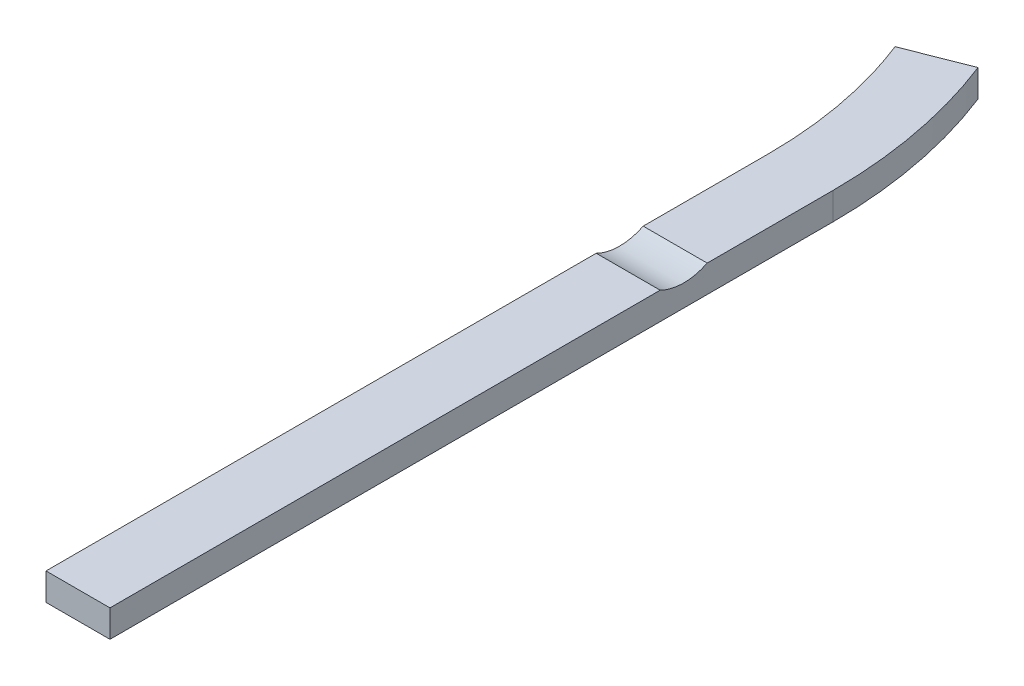
ISO-10303-21;
HEADER;
FILE_DESCRIPTION(('STEP AP214'),'2;1');
FILE_NAME('part.step','',(''),(''),'','','');
FILE_SCHEMA(('AUTOMOTIVE_DESIGN { 1 0 10303 214 1 1 1 1 }'));
ENDSEC;
DATA;
#1=APPLICATION_CONTEXT('core data for automotive mechanical design processes');
#2=APPLICATION_PROTOCOL_DEFINITION('international standard','automotive_design',2000,#1);
#3=PRODUCT_CONTEXT('',#1,'mechanical');
#4=PRODUCT('Part','Part','',(#3));
#5=PRODUCT_RELATED_PRODUCT_CATEGORY('part','',(#4));
#6=PRODUCT_DEFINITION_FORMATION('','',#4);
#7=PRODUCT_DEFINITION_CONTEXT('part definition',#1,'design');
#8=PRODUCT_DEFINITION('design','',#6,#7);
#9=PRODUCT_DEFINITION_SHAPE('','',#8);
#10=(LENGTH_UNIT() NAMED_UNIT(*) SI_UNIT(.MILLI.,.METRE.));
#11=(NAMED_UNIT(*) PLANE_ANGLE_UNIT() SI_UNIT($,.RADIAN.));
#12=(NAMED_UNIT(*) SI_UNIT($,.STERADIAN.) SOLID_ANGLE_UNIT());
#13=UNCERTAINTY_MEASURE_WITH_UNIT(LENGTH_MEASURE(1.E-05),#10,'distance_accuracy_value','');
#14=(GEOMETRIC_REPRESENTATION_CONTEXT(3) GLOBAL_UNCERTAINTY_ASSIGNED_CONTEXT((#13)) GLOBAL_UNIT_ASSIGNED_CONTEXT((#10,
#11,#12)) REPRESENTATION_CONTEXT('',''));
#15=CARTESIAN_POINT('',(0.,0.,0.));
#16=DIRECTION('',(0.,0.,1.));
#17=DIRECTION('',(1.,0.,0.));
#18=AXIS2_PLACEMENT_3D('',#15,#16,#17);
#19=CARTESIAN_POINT('',(207.825,20.84183441299,-37.61967793308));
#20=DIRECTION('',(0.,1.,0.));
#21=DIRECTION('',(0.,0.,1.));
#22=AXIS2_PLACEMENT_3D('',#19,#20,#21);
#23=PLANE('',#22);
#24=CARTESIAN_POINT('',(209.800003315921,20.8418344129906,-58.1141130504038));
#25=CARTESIAN_POINT('',(209.141670177305,20.8418344129906,-58.1141788166733));
#26=CARTESIAN_POINT('',(208.483337038689,20.8418344129906,-58.1142445885298));
#27=CARTESIAN_POINT('',(207.166670761458,20.8418344129906,-58.1143761434172));
#28=CARTESIAN_POINT('',(206.508337622843,20.8418344129906,-58.114441926448));
#29=CARTESIAN_POINT('',(205.850004484228,20.8418344129906,-58.1145077150658));
#30=B_SPLINE_CURVE_WITH_KNOTS('',3,(#24,#25,#26,#27,#28,#29),.UNSPECIFIED.,.F.,.F.,(4,2,4),(0.,
1.97499942570457,3.94999885140915),.UNSPECIFIED.);
#31=CARTESIAN_POINT('',(209.800001657661,20.8418344129906,-58.1141130505695));
#32=VERTEX_POINT('',#31);
#33=CARTESIAN_POINT('',(205.850002242115,20.8418344129906,-58.1145077152899));
#34=VERTEX_POINT('',#33);
#35=EDGE_CURVE('E21',#32,#34,#30,.T.);
#36=ORIENTED_EDGE('',*,*,#35,.T.);
#37=DIRECTION('',(0.,0.,-1.));
#38=VECTOR('',#37,1.);
#39=CARTESIAN_POINT('',(205.85,20.8418344129909,-68.7999999999978));
#40=LINE('',#39,#38);
#41=CARTESIAN_POINT('',(205.85,20.8418344129898,-24.14009611321));
#42=VERTEX_POINT('',#41);
#43=EDGE_CURVE('E119',#42,#34,#40,.T.);
#44=ORIENTED_EDGE('',*,*,#43,.F.);
#45=DIRECTION('',(-1.,0.,0.));
#46=VECTOR('',#45,1.);
#47=CARTESIAN_POINT('',(207.825,20.84183441299,-24.14009611321));
#48=LINE('',#47,#46);
#49=CARTESIAN_POINT('',(209.7999999997,20.8418344129899,-24.14009611321));
#50=VERTEX_POINT('',#49);
#51=EDGE_CURVE('E89',#42,#50,#48,.F.);
#52=ORIENTED_EDGE('',*,*,#51,.T.);
#53=DIRECTION('',(0.,0.,1.));
#54=VECTOR('',#53,1.);
#55=CARTESIAN_POINT('',(209.7999999994,20.84183441299,-37.61967793308));
#56=LINE('',#55,#54);
#57=EDGE_CURVE('E85',#50,#32,#56,.F.);
#58=ORIENTED_EDGE('',*,*,#57,.T.);
#59=EDGE_LOOP('',(#36,#44,#52,#58));
#60=FACE_BOUND('',#59,.T.);
#61=ADVANCED_FACE('F17',(#60),#23,.T.);
#62=CARTESIAN_POINT('',(207.825,23.75009843451,-59.56499999621));
#63=DIRECTION('',(0.999999998757974,-4.98402579270987E-05,-1.91760193983295E-09));
#64=DIRECTION('',(4.98402579270987E-05,0.999999998757974,0.));
#65=AXIS2_PLACEMENT_3D('',#62,#63,#64);
#66=CYLINDRICAL_SURFACE('',#65,3.25);
#67=CARTESIAN_POINT('',(205.85,23.7501968690195,-59.5649999924227));
#68=DIRECTION('',(-1.,0.,0.));
#69=DIRECTION('',(0.,-0.999999999259839,-3.84749601661069E-05));
#70=AXIS2_PLACEMENT_3D('',#67,#68,#69);
#71=ELLIPSE('',#70,3.25000000403658,3.25);
#72=CARTESIAN_POINT('',(205.850000959887,20.8419964703173,-61.0158171629429));
#73=VERTEX_POINT('',#72);
#74=EDGE_CURVE('E101',#34,#73,#71,.F.);
#75=ORIENTED_EDGE('',*,*,#74,.F.);
#76=ORIENTED_EDGE('',*,*,#35,.F.);
#77=CARTESIAN_POINT('',(209.8,23.7500000000005,-59.5649999999973));
#78=DIRECTION('',(-1.,0.,0.));
#79=DIRECTION('',(0.,-0.999999999259839,-3.84749601661069E-05));
#80=AXIS2_PLACEMENT_3D('',#77,#78,#79);
#81=ELLIPSE('',#80,3.25000000403658,3.25);
#82=CARTESIAN_POINT('',(209.800001853987,20.8419964815801,-61.0162117551865));
#83=VERTEX_POINT('',#82);
#84=EDGE_CURVE('E94',#32,#83,#81,.F.);
#85=ORIENTED_EDGE('',*,*,#84,.T.);
#86=CARTESIAN_POINT('',(205.85000191976,20.8419964703173,-61.0158171630388));
#87=CARTESIAN_POINT('',(206.508335551128,20.8419964721947,-61.0158829395963));
#88=CARTESIAN_POINT('',(207.166669182497,20.841996474072,-61.0159487105694));
#89=CARTESIAN_POINT('',(208.483336445235,20.8419964778263,-61.016080241347));
#90=CARTESIAN_POINT('',(209.141670076605,20.8419964797033,-61.0161460011515));
#91=CARTESIAN_POINT('',(209.800003707975,20.8419964815801,-61.0162117553717));
#92=B_SPLINE_CURVE_WITH_KNOTS('',3,(#86,#87,#88,#89,#90,#91),.UNSPECIFIED.,.F.,.F.,(4,2,4),(0.,
1.97500090396184,3.95000180792366),.UNSPECIFIED.);
#93=EDGE_CURVE('E103',#73,#83,#92,.T.);
#94=ORIENTED_EDGE('',*,*,#93,.F.);
#95=EDGE_LOOP('',(#75,#76,#85,#94));
#96=FACE_BOUND('',#95,.T.);
#97=ADVANCED_FACE('F98',(#96),#66,.F.);
#98=CARTESIAN_POINT('',(207.82499996,20.84209817804,-64.51849192047));
#99=DIRECTION('',(4.9360236253941E-11,0.999999999578421,2.90371865022706E-05));
#100=DIRECTION('',(0.,-2.90371865022706E-05,0.999999999578421));
#101=AXIS2_PLACEMENT_3D('',#98,#99,#100);
#102=PLANE('',#101);
#103=CARTESIAN_POINT('',(179.4760308089,20.8422214489998,-68.76372278604));
#104=DIRECTION('',(4.9360236253941E-11,0.999999999578421,2.90371865022706E-05));
#105=DIRECTION('',(1.69989734471006E-06,-2.90371865023126E-05,0.999999999576976));
#106=AXIS2_PLACEMENT_3D('',#103,#104,#105);
#107=ELLIPSE('',#106,26.3739905895787,26.37399057846);
#108=CARTESIAN_POINT('',(204.030346044496,20.8425009795123,-78.3904035402455));
#109=VERTEX_POINT('',#108);
#110=CARTESIAN_POINT('',(205.849999999037,20.8422224230148,-68.797311331455));
#111=VERTEX_POINT('',#110);
#112=EDGE_CURVE('E117',#109,#111,#107,.F.);
#113=ORIENTED_EDGE('',*,*,#112,.T.);
#114=DIRECTION('',(0.,2.90371865022706E-05,-0.999999999578421));
#115=VECTOR('',#114,1.);
#116=CARTESIAN_POINT('',(205.85,20.8422224379823,-68.7978267924279));
#117=LINE('',#116,#115);
#118=EDGE_CURVE('E122',#73,#111,#117,.T.);
#119=ORIENTED_EDGE('',*,*,#118,.F.);
#120=ORIENTED_EDGE('',*,*,#93,.T.);
#121=DIRECTION('',(0.,2.90371865022706E-05,-0.999999999578421));
#122=VECTOR('',#121,1.);
#123=CARTESIAN_POINT('',(209.8,20.8422224377873,-68.7978267924279));
#124=LINE('',#123,#122);
#125=CARTESIAN_POINT('',(209.8,20.84222250115,-68.8000089149787));
#126=VERTEX_POINT('',#125);
#127=EDGE_CURVE('E106',#83,#126,#124,.T.);
#128=ORIENTED_EDGE('',*,*,#127,.T.);
#129=CARTESIAN_POINT('',(179.4760308089,20.8422214489998,-68.76372278604));
#130=DIRECTION('',(4.9360236253941E-11,0.999999999578421,2.90371865022706E-05));
#131=DIRECTION('',(1.69989734471006E-06,-2.90371865023126E-05,0.999999999576976));
#132=AXIS2_PLACEMENT_3D('',#129,#130,#131);
#133=ELLIPSE('',#132,30.323990591244,30.32399057846);
#134=CARTESIAN_POINT('',(207.707815516139,20.842542844452,-79.832179627292));
#135=VERTEX_POINT('',#134);
#136=EDGE_CURVE('E95',#135,#126,#133,.F.);
#137=ORIENTED_EDGE('',*,*,#136,.F.);
#138=DIRECTION('',(-0.93100492970265,-1.05987188769113E-05,0.365006603717017));
#139=VECTOR('',#138,1.);
#140=CARTESIAN_POINT('',(207.707815511446,20.842542844452,-79.8321796285804));
#141=LINE('',#140,#139);
#142=EDGE_CURVE('E113',#135,#109,#141,.T.);
#143=ORIENTED_EDGE('',*,*,#142,.T.);
#144=EDGE_LOOP('',(#113,#119,#120,#128,#137,#143));
#145=FACE_BOUND('',#144,.T.);
#146=ADVANCED_FACE('F131',(#145),#102,.T.);
#147=CARTESIAN_POINT('',(207.825,19.99988393086,-24.14009611321));
#148=DIRECTION('',(0.,0.,-1.));
#149=DIRECTION('',(-1.,0.,0.));
#150=AXIS2_PLACEMENT_3D('',#147,#148,#149);
#151=PLANE('',#150);
#152=DIRECTION('',(0.,1.,0.));
#153=VECTOR('',#152,1.);
#154=CARTESIAN_POINT('',(205.85,-54.,-24.14009611321));
#155=LINE('',#154,#153);
#156=CARTESIAN_POINT('',(205.850000139397,19.1578818994322,-24.14009611321));
#157=VERTEX_POINT('',#156);
#158=EDGE_CURVE('E121',#157,#42,#155,.T.);
#159=ORIENTED_EDGE('',*,*,#158,.F.);
#160=DIRECTION('',(0.999999998273092,5.87691826888495E-05,0.));
#161=VECTOR('',#160,1.);
#162=CARTESIAN_POINT('',(207.825,19.15799796856,-24.14009611321));
#163=LINE('',#162,#161);
#164=CARTESIAN_POINT('',(209.799999925739,19.1581140376916,-24.14009611321));
#165=VERTEX_POINT('',#164);
#166=EDGE_CURVE('E174',#165,#157,#163,.F.);
#167=ORIENTED_EDGE('',*,*,#166,.F.);
#168=DIRECTION('',(0.,1.,0.));
#169=VECTOR('',#168,1.);
#170=CARTESIAN_POINT('',(209.8,-54.,-24.14009611321));
#171=LINE('',#170,#169);
#172=EDGE_CURVE('E176',#165,#50,#171,.T.);
#173=ORIENTED_EDGE('',*,*,#172,.T.);
#174=ORIENTED_EDGE('',*,*,#51,.F.);
#175=EDGE_LOOP('',(#159,#167,#173,#174));
#176=FACE_BOUND('',#175,.T.);
#177=ADVANCED_FACE('F135',(#176),#151,.F.);
#178=CARTESIAN_POINT('',(205.85,-54.,-68.8));
#179=DIRECTION('',(-1.,0.,0.));
#180=DIRECTION('',(0.,0.,1.));
#181=AXIS2_PLACEMENT_3D('',#178,#179,#180);
#182=PLANE('',#181);
#183=ORIENTED_EDGE('',*,*,#158,.T.);
#184=ORIENTED_EDGE('',*,*,#43,.T.);
#185=ORIENTED_EDGE('',*,*,#74,.T.);
#186=ORIENTED_EDGE('',*,*,#118,.T.);
#187=CARTESIAN_POINT('',(205.8499999981,20.84289771383,-68.79731206776));
#188=CARTESIAN_POINT('',(205.850000087187,20.7726851474321,-68.7972421168764));
#189=CARTESIAN_POINT('',(205.850000175997,20.7024725810342,-68.7971721659924));
#190=CARTESIAN_POINT('',(205.850000353059,20.5620474482383,-68.7970322642237));
#191=CARTESIAN_POINT('',(205.850000441312,20.4918348818404,-68.796962313339));
#192=CARTESIAN_POINT('',(205.850000617262,20.3514097490446,-68.796822411569));
#193=CARTESIAN_POINT('',(205.850000704958,20.2811971826467,-68.7967524606836));
#194=CARTESIAN_POINT('',(205.850000879794,20.1407720498508,-68.7966125589121));
#195=CARTESIAN_POINT('',(205.850000966934,20.0705594834529,-68.796542608026));
#196=CARTESIAN_POINT('',(205.850001140657,19.9301343506571,-68.7964027062532));
#197=CARTESIAN_POINT('',(205.85000122724,19.8599217842592,-68.7963327553664));
#198=CARTESIAN_POINT('',(205.85000139985,19.7194966514633,-68.7961928535922));
#199=CARTESIAN_POINT('',(205.850001485877,19.6492840850654,-68.7961229027047));
#200=CARTESIAN_POINT('',(205.850001657373,19.5088589522696,-68.7959830009291));
#201=CARTESIAN_POINT('',(205.850001742843,19.4386463858717,-68.795913050041));
#202=CARTESIAN_POINT('',(205.850001913227,19.2982212530758,-68.795773148264));
#203=CARTESIAN_POINT('',(205.85000199814,19.2280086866779,-68.7957031973752));
#204=CARTESIAN_POINT('',(205.850002082776,19.15779612028,-68.795633246486));
#205=B_SPLINE_CURVE_WITH_KNOTS('',3,(#187,#188,#189,#190,#191,#192,#193,#194,#195,#196,#197,
#198,#199,#200,#201,#202,#203,#204),.UNSPECIFIED.,.F.,.F.,(4,2,2,2,2,2,2,2,4),(0.,
0.210637803729166,0.421275607458318,0.63191341118747,0.842551214916622,1.05318901864579,
1.26382682237494,1.47446462610411,1.68510242983326),.UNSPECIFIED.);
#206=CARTESIAN_POINT('',(205.850002082723,19.1578818994513,-68.7956332895382));
#207=VERTEX_POINT('',#206);
#208=EDGE_CURVE('E116',#111,#207,#205,.T.);
#209=ORIENTED_EDGE('',*,*,#208,.T.);
#210=DIRECTION('',(0.,0.,1.));
#211=VECTOR('',#210,1.);
#212=CARTESIAN_POINT('',(205.850000278795,19.1578818994404,-46.46937898824));
#213=LINE('',#212,#211);
#214=EDGE_CURVE('E172',#157,#207,#213,.F.);
#215=ORIENTED_EDGE('',*,*,#214,.F.);
#216=EDGE_LOOP('',(#183,#184,#185,#186,#209,#215));
#217=FACE_BOUND('',#216,.T.);
#218=ADVANCED_FACE('F139',(#217),#182,.T.);
#219=CARTESIAN_POINT('',(179.4760308089,-54.,-68.76372278604));
#220=DIRECTION('',(0.,-1.,0.));
#221=DIRECTION('',(0.,0.,-1.));
#222=AXIS2_PLACEMENT_3D('',#219,#220,#221);
#223=CYLINDRICAL_SURFACE('',#222,26.37399057846);
#224=CARTESIAN_POINT('',(179.4760308089,19.1563319228077,-68.76372278604));
#225=DIRECTION('',(5.87691826888495E-05,-0.999999998273092,0.));
#226=DIRECTION('',(-0.999999998273092,-5.87691826888495E-05,0.));
#227=AXIS2_PLACEMENT_3D('',#224,#225,#226);
#228=ELLIPSE('',#227,26.3739906240055,26.37399057846);
#229=CARTESIAN_POINT('',(204.030346045627,19.1577749598481,-78.3904035373592));
#230=VERTEX_POINT('',#229);
#231=EDGE_CURVE('E169',#207,#230,#228,.F.);
#232=ORIENTED_EDGE('',*,*,#231,.F.);
#233=ORIENTED_EDGE('',*,*,#208,.F.);
#234=ORIENTED_EDGE('',*,*,#112,.F.);
#235=DIRECTION('',(0.,1.,0.));
#236=VECTOR('',#235,1.);
#237=CARTESIAN_POINT('',(204.030346046448,20.00029222718,-78.3904035352509));
#238=LINE('',#237,#236);
#239=EDGE_CURVE('E115',#109,#230,#238,.F.);
#240=ORIENTED_EDGE('',*,*,#239,.T.);
#241=EDGE_LOOP('',(#232,#233,#234,#240));
#242=FACE_BOUND('',#241,.T.);
#243=ADVANCED_FACE('F143',(#242),#223,.F.);
#244=CARTESIAN_POINT('',(205.8690807821,20.00029222718,-79.11129157922));
#245=DIRECTION('',(0.365006604539887,0.,0.931004929440367));
#246=DIRECTION('',(0.931004929440367,0.,-0.365006604539887));
#247=AXIS2_PLACEMENT_3D('',#244,#245,#246);
#248=PLANE('',#247);
#249=ORIENTED_EDGE('',*,*,#239,.F.);
#250=ORIENTED_EDGE('',*,*,#142,.F.);
#251=DIRECTION('',(0.,-1.,0.));
#252=VECTOR('',#251,1.);
#253=CARTESIAN_POINT('',(207.707815517202,-54.,-79.8321796245806));
#254=LINE('',#253,#252);
#255=CARTESIAN_POINT('',(207.707815516192,19.1579910817236,-79.8321796271554));
#256=VERTEX_POINT('',#255);
#257=EDGE_CURVE('E112',#256,#135,#254,.F.);
#258=ORIENTED_EDGE('',*,*,#257,.F.);
#259=DIRECTION('',(0.931004927815523,5.47143987812778E-05,-0.365006604583461));
#260=VECTOR('',#259,1.);
#261=CARTESIAN_POINT('',(204.030346037161,19.1577749598476,-78.39040353647));
#262=LINE('',#261,#260);
#263=EDGE_CURVE('E166',#230,#256,#262,.T.);
#264=ORIENTED_EDGE('',*,*,#263,.F.);
#265=EDGE_LOOP('',(#249,#250,#258,#264));
#266=FACE_BOUND('',#265,.T.);
#267=ADVANCED_FACE('F148',(#266),#248,.F.);
#268=CARTESIAN_POINT('',(179.4760308089,-54.,-68.76372278604));
#269=DIRECTION('',(0.,-1.,0.));
#270=DIRECTION('',(0.,0.,-1.));
#271=AXIS2_PLACEMENT_3D('',#268,#269,#270);
#272=CYLINDRICAL_SURFACE('',#271,30.32399057846);
#273=ORIENTED_EDGE('',*,*,#257,.T.);
#274=ORIENTED_EDGE('',*,*,#136,.T.);
#275=DIRECTION('',(0.,1.,0.));
#276=VECTOR('',#275,1.);
#277=CARTESIAN_POINT('',(209.8,-54.,-68.80000890277));
#278=LINE('',#277,#276);
#279=CARTESIAN_POINT('',(209.799999925739,19.1581140376917,-68.80000956279));
#280=VERTEX_POINT('',#279);
#281=EDGE_CURVE('E40',#126,#280,#278,.F.);
#282=ORIENTED_EDGE('',*,*,#281,.T.);
#283=CARTESIAN_POINT('',(179.4760308089,19.1563319228077,-68.76372278604));
#284=DIRECTION('',(5.87691826888495E-05,-0.999999998273092,0.));
#285=DIRECTION('',(-0.999999998273092,-5.87691826888495E-05,0.));
#286=AXIS2_PLACEMENT_3D('',#283,#284,#285);
#287=ELLIPSE('',#286,30.3239906308267,30.32399057846);
#288=EDGE_CURVE('E31',#256,#280,#287,.T.);
#289=ORIENTED_EDGE('',*,*,#288,.F.);
#290=EDGE_LOOP('',(#273,#274,#282,#289));
#291=FACE_BOUND('',#290,.T.);
#292=ADVANCED_FACE('F191',(#291),#272,.T.);
#293=CARTESIAN_POINT('',(209.8,-54.,-68.8));
#294=DIRECTION('',(-1.,0.,0.));
#295=DIRECTION('',(0.,0.,1.));
#296=AXIS2_PLACEMENT_3D('',#293,#294,#295);
#297=PLANE('',#296);
#298=DIRECTION('',(0.,0.,1.));
#299=VECTOR('',#298,1.);
#300=CARTESIAN_POINT('',(209.799999851479,19.1581140376873,-46.46937898824));
#301=LINE('',#300,#299);
#302=EDGE_CURVE('E11',#280,#165,#301,.T.);
#303=ORIENTED_EDGE('',*,*,#302,.F.);
#304=ORIENTED_EDGE('',*,*,#281,.F.);
#305=ORIENTED_EDGE('',*,*,#127,.F.);
#306=ORIENTED_EDGE('',*,*,#84,.F.);
#307=ORIENTED_EDGE('',*,*,#57,.F.);
#308=ORIENTED_EDGE('',*,*,#172,.F.);
#309=EDGE_LOOP('',(#303,#304,#305,#306,#307,#308));
#310=FACE_BOUND('',#309,.T.);
#311=ADVANCED_FACE('F105',(#310),#297,.F.);
#312=CARTESIAN_POINT('',(207.825,19.15799796856,-46.46937898824));
#313=DIRECTION('',(5.87691826888495E-05,-0.999999998273092,0.));
#314=DIRECTION('',(0.999999998273092,5.87691826888495E-05,0.));
#315=AXIS2_PLACEMENT_3D('',#312,#313,#314);
#316=PLANE('',#315);
#317=ORIENTED_EDGE('',*,*,#288,.T.);
#318=ORIENTED_EDGE('',*,*,#302,.T.);
#319=ORIENTED_EDGE('',*,*,#166,.T.);
#320=ORIENTED_EDGE('',*,*,#214,.T.);
#321=ORIENTED_EDGE('',*,*,#231,.T.);
#322=ORIENTED_EDGE('',*,*,#263,.T.);
#323=EDGE_LOOP('',(#317,#318,#319,#320,#321,#322));
#324=FACE_BOUND('',#323,.T.);
#325=ADVANCED_FACE('F187',(#324),#316,.T.);
#326=CLOSED_SHELL('',(#61,#97,#146,#177,#218,#243,#267,#292,#311,#325));
#327=MANIFOLD_SOLID_BREP('B1',#326);
#328=ADVANCED_BREP_SHAPE_REPRESENTATION('',(#18,#327),#14);
#329=SHAPE_DEFINITION_REPRESENTATION(#9,#328);
ENDSEC;
END-ISO-10303-21;
